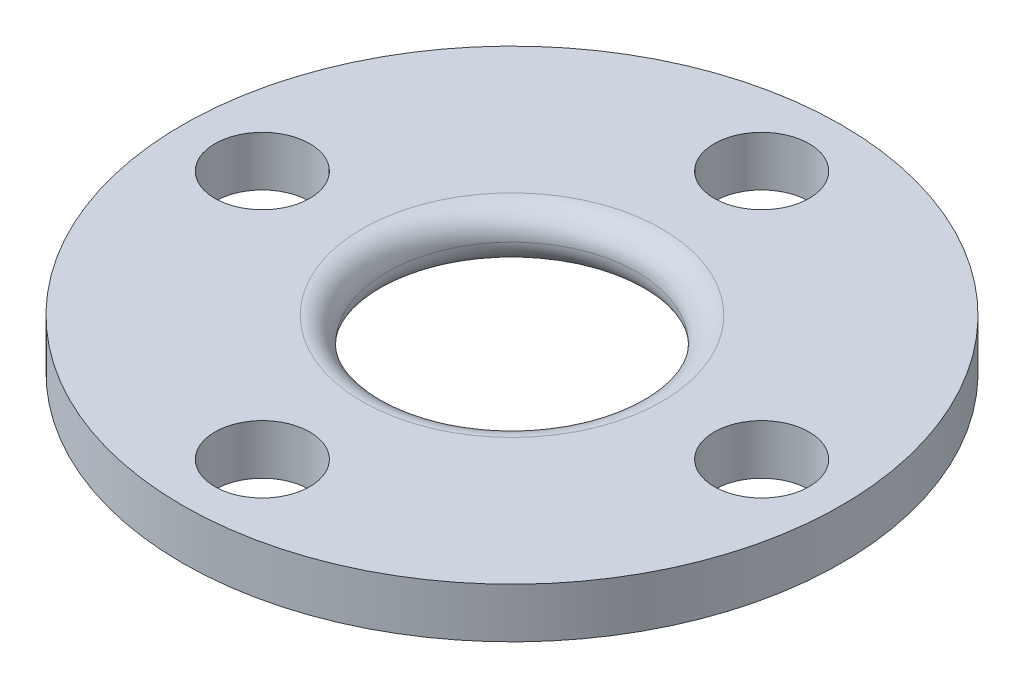
ISO-10303-21;
HEADER;
FILE_DESCRIPTION(('STEP AP214'),'2;1');
FILE_NAME('part.step','',(''),(''),'','','');
FILE_SCHEMA(('AUTOMOTIVE_DESIGN { 1 0 10303 214 1 1 1 1 }'));
ENDSEC;
DATA;
#1=APPLICATION_CONTEXT('core data for automotive mechanical design processes');
#2=APPLICATION_PROTOCOL_DEFINITION('international standard','automotive_design',2000,#1);
#3=PRODUCT_CONTEXT('',#1,'mechanical');
#4=PRODUCT('Part','Part','',(#3));
#5=PRODUCT_RELATED_PRODUCT_CATEGORY('part','',(#4));
#6=PRODUCT_DEFINITION_FORMATION('','',#4);
#7=PRODUCT_DEFINITION_CONTEXT('part definition',#1,'design');
#8=PRODUCT_DEFINITION('design','',#6,#7);
#9=PRODUCT_DEFINITION_SHAPE('','',#8);
#10=(LENGTH_UNIT() NAMED_UNIT(*) SI_UNIT(.MILLI.,.METRE.));
#11=(NAMED_UNIT(*) PLANE_ANGLE_UNIT() SI_UNIT($,.RADIAN.));
#12=(NAMED_UNIT(*) SI_UNIT($,.STERADIAN.) SOLID_ANGLE_UNIT());
#13=UNCERTAINTY_MEASURE_WITH_UNIT(LENGTH_MEASURE(1.E-05),#10,'distance_accuracy_value','');
#14=(GEOMETRIC_REPRESENTATION_CONTEXT(3) GLOBAL_UNCERTAINTY_ASSIGNED_CONTEXT((#13)) GLOBAL_UNIT_ASSIGNED_CONTEXT((#10,
#11,#12)) REPRESENTATION_CONTEXT('',''));
#15=CARTESIAN_POINT('',(0.,0.,0.));
#16=DIRECTION('',(0.,0.,1.));
#17=DIRECTION('',(1.,0.,0.));
#18=AXIS2_PLACEMENT_3D('',#15,#16,#17);
#19=CARTESIAN_POINT('',(0.,2.,0.));
#20=DIRECTION('',(0.,-1.,0.));
#21=DIRECTION('',(0.,0.,-1.));
#22=AXIS2_PLACEMENT_3D('',#19,#20,#21);
#23=CYLINDRICAL_SURFACE('',#22,13.2);
#24=CARTESIAN_POINT('',(0.,2.,0.));
#25=DIRECTION('',(0.,1.,0.));
#26=DIRECTION('',(0.,0.,1.));
#27=AXIS2_PLACEMENT_3D('',#24,#25,#26);
#28=CIRCLE('',#27,13.2);
#29=CARTESIAN_POINT('',(0.,2.,13.2));
#30=VERTEX_POINT('',#29);
#31=EDGE_CURVE('E53',#30,#30,#28,.T.);
#32=ORIENTED_EDGE('',*,*,#31,.F.);
#33=EDGE_LOOP('',(#32));
#34=FACE_BOUND('',#33,.T.);
#35=CARTESIAN_POINT('',(0.,0.,0.));
#36=DIRECTION('',(0.,1.,0.));
#37=DIRECTION('',(0.,0.,1.));
#38=AXIS2_PLACEMENT_3D('',#35,#36,#37);
#39=CIRCLE('',#38,13.2);
#40=CARTESIAN_POINT('',(0.,0.,13.2));
#41=VERTEX_POINT('',#40);
#42=EDGE_CURVE('E56',#41,#41,#39,.T.);
#43=ORIENTED_EDGE('',*,*,#42,.T.);
#44=EDGE_LOOP('',(#43));
#45=FACE_BOUND('',#44,.T.);
#46=ADVANCED_FACE('F41',(#34,#45),#23,.T.);
#47=CARTESIAN_POINT('',(0.,2.,0.));
#48=DIRECTION('',(0.,1.,0.));
#49=DIRECTION('',(0.,0.,1.));
#50=AXIS2_PLACEMENT_3D('',#47,#48,#49);
#51=PLANE('',#50);
#52=CARTESIAN_POINT('',(0.,2.,0.));
#53=DIRECTION('',(0.,1.,0.));
#54=DIRECTION('',(0.,0.,1.));
#55=AXIS2_PLACEMENT_3D('',#52,#53,#54);
#56=CIRCLE('',#55,6.);
#57=CARTESIAN_POINT('',(0.,2.,6.));
#58=VERTEX_POINT('',#57);
#59=EDGE_CURVE('E10',#58,#58,#56,.F.);
#60=ORIENTED_EDGE('',*,*,#59,.T.);
#61=EDGE_LOOP('',(#60));
#62=FACE_BOUND('',#61,.T.);
#63=CARTESIAN_POINT('',(10.,2.,0.));
#64=DIRECTION('',(0.,1.,0.));
#65=DIRECTION('',(-1.,0.,0.));
#66=AXIS2_PLACEMENT_3D('',#63,#64,#65);
#67=CIRCLE('',#66,1.9);
#68=CARTESIAN_POINT('',(8.1,2.,0.));
#69=VERTEX_POINT('',#68);
#70=EDGE_CURVE('E80',#69,#69,#67,.T.);
#71=ORIENTED_EDGE('',*,*,#70,.F.);
#72=EDGE_LOOP('',(#71));
#73=FACE_BOUND('',#72,.T.);
#74=CARTESIAN_POINT('',(0.,2.,10.));
#75=DIRECTION('',(0.,1.,0.));
#76=DIRECTION('',(0.,0.,-1.));
#77=AXIS2_PLACEMENT_3D('',#74,#75,#76);
#78=CIRCLE('',#77,1.9);
#79=CARTESIAN_POINT('',(0.,2.,8.1));
#80=VERTEX_POINT('',#79);
#81=EDGE_CURVE('E74',#80,#80,#78,.T.);
#82=ORIENTED_EDGE('',*,*,#81,.F.);
#83=EDGE_LOOP('',(#82));
#84=FACE_BOUND('',#83,.T.);
#85=CARTESIAN_POINT('',(-10.,2.,-1.04744440165294E-13));
#86=DIRECTION('',(0.,1.,0.));
#87=DIRECTION('',(1.,0.,0.));
#88=AXIS2_PLACEMENT_3D('',#85,#86,#87);
#89=CIRCLE('',#88,1.9);
#90=CARTESIAN_POINT('',(-8.1,2.,0.));
#91=VERTEX_POINT('',#90);
#92=EDGE_CURVE('E68',#91,#91,#89,.T.);
#93=ORIENTED_EDGE('',*,*,#92,.F.);
#94=EDGE_LOOP('',(#93));
#95=FACE_BOUND('',#94,.T.);
#96=CARTESIAN_POINT('',(0.,2.,-10.));
#97=DIRECTION('',(0.,1.,0.));
#98=DIRECTION('',(0.,0.,1.));
#99=AXIS2_PLACEMENT_3D('',#96,#97,#98);
#100=CIRCLE('',#99,1.9);
#101=CARTESIAN_POINT('',(0.,2.,-8.1));
#102=VERTEX_POINT('',#101);
#103=EDGE_CURVE('E62',#102,#102,#100,.T.);
#104=ORIENTED_EDGE('',*,*,#103,.F.);
#105=EDGE_LOOP('',(#104));
#106=FACE_BOUND('',#105,.T.);
#107=ORIENTED_EDGE('',*,*,#31,.T.);
#108=EDGE_LOOP('',(#107));
#109=FACE_BOUND('',#108,.T.);
#110=ADVANCED_FACE('F96',(#62,#73,#84,#95,#106,#109),#51,.T.);
#111=CARTESIAN_POINT('',(0.,0.,0.));
#112=DIRECTION('',(0.,1.,0.));
#113=DIRECTION('',(0.,0.,1.));
#114=AXIS2_PLACEMENT_3D('',#111,#112,#113);
#115=PLANE('',#114);
#116=CARTESIAN_POINT('',(0.,0.,0.));
#117=DIRECTION('',(0.,1.,0.));
#118=DIRECTION('',(0.,0.,1.));
#119=AXIS2_PLACEMENT_3D('',#116,#117,#118);
#120=CIRCLE('',#119,6.);
#121=CARTESIAN_POINT('',(0.,0.,6.));
#122=VERTEX_POINT('',#121);
#123=EDGE_CURVE('E49',#122,#122,#120,.T.);
#124=ORIENTED_EDGE('',*,*,#123,.T.);
#125=EDGE_LOOP('',(#124));
#126=FACE_BOUND('',#125,.T.);
#127=CARTESIAN_POINT('',(10.,0.,0.));
#128=DIRECTION('',(0.,1.,0.));
#129=DIRECTION('',(-1.,0.,0.));
#130=AXIS2_PLACEMENT_3D('',#127,#128,#129);
#131=CIRCLE('',#130,1.9);
#132=CARTESIAN_POINT('',(8.1,0.,0.));
#133=VERTEX_POINT('',#132);
#134=EDGE_CURVE('E65',#133,#133,#131,.T.);
#135=ORIENTED_EDGE('',*,*,#134,.T.);
#136=EDGE_LOOP('',(#135));
#137=FACE_BOUND('',#136,.T.);
#138=CARTESIAN_POINT('',(0.,0.,10.));
#139=DIRECTION('',(0.,1.,0.));
#140=DIRECTION('',(0.,0.,-1.));
#141=AXIS2_PLACEMENT_3D('',#138,#139,#140);
#142=CIRCLE('',#141,1.9);
#143=CARTESIAN_POINT('',(0.,0.,8.1));
#144=VERTEX_POINT('',#143);
#145=EDGE_CURVE('E77',#144,#144,#142,.T.);
#146=ORIENTED_EDGE('',*,*,#145,.T.);
#147=EDGE_LOOP('',(#146));
#148=FACE_BOUND('',#147,.T.);
#149=CARTESIAN_POINT('',(-10.,0.,-1.04744440165294E-13));
#150=DIRECTION('',(0.,1.,0.));
#151=DIRECTION('',(1.,0.,0.));
#152=AXIS2_PLACEMENT_3D('',#149,#150,#151);
#153=CIRCLE('',#152,1.9);
#154=CARTESIAN_POINT('',(-8.1,0.,0.));
#155=VERTEX_POINT('',#154);
#156=EDGE_CURVE('E71',#155,#155,#153,.T.);
#157=ORIENTED_EDGE('',*,*,#156,.T.);
#158=EDGE_LOOP('',(#157));
#159=FACE_BOUND('',#158,.T.);
#160=CARTESIAN_POINT('',(0.,0.,-10.));
#161=DIRECTION('',(0.,1.,0.));
#162=DIRECTION('',(0.,0.,1.));
#163=AXIS2_PLACEMENT_3D('',#160,#161,#162);
#164=CIRCLE('',#163,1.9);
#165=CARTESIAN_POINT('',(0.,0.,-8.1));
#166=VERTEX_POINT('',#165);
#167=EDGE_CURVE('E59',#166,#166,#164,.T.);
#168=ORIENTED_EDGE('',*,*,#167,.T.);
#169=EDGE_LOOP('',(#168));
#170=FACE_BOUND('',#169,.T.);
#171=ORIENTED_EDGE('',*,*,#42,.F.);
#172=EDGE_LOOP('',(#171));
#173=FACE_BOUND('',#172,.T.);
#174=ADVANCED_FACE('F86',(#126,#137,#148,#159,#170,#173),#115,.F.);
#175=CARTESIAN_POINT('',(0.,0.,-10.));
#176=DIRECTION('',(0.,1.,0.));
#177=DIRECTION('',(0.,0.,1.));
#178=AXIS2_PLACEMENT_3D('',#175,#176,#177);
#179=CYLINDRICAL_SURFACE('',#178,1.9);
#180=ORIENTED_EDGE('',*,*,#167,.F.);
#181=EDGE_LOOP('',(#180));
#182=FACE_BOUND('',#181,.T.);
#183=ORIENTED_EDGE('',*,*,#103,.T.);
#184=EDGE_LOOP('',(#183));
#185=FACE_BOUND('',#184,.T.);
#186=ADVANCED_FACE('F114',(#182,#185),#179,.F.);
#187=CARTESIAN_POINT('',(-10.,0.,-1.04744440165294E-13));
#188=DIRECTION('',(0.,1.,0.));
#189=DIRECTION('',(0.,0.,1.));
#190=AXIS2_PLACEMENT_3D('',#187,#188,#189);
#191=CYLINDRICAL_SURFACE('',#190,1.9);
#192=ORIENTED_EDGE('',*,*,#156,.F.);
#193=EDGE_LOOP('',(#192));
#194=FACE_BOUND('',#193,.T.);
#195=ORIENTED_EDGE('',*,*,#92,.T.);
#196=EDGE_LOOP('',(#195));
#197=FACE_BOUND('',#196,.T.);
#198=ADVANCED_FACE('F121',(#194,#197),#191,.F.);
#199=CARTESIAN_POINT('',(0.,0.,10.));
#200=DIRECTION('',(0.,1.,0.));
#201=DIRECTION('',(0.,0.,1.));
#202=AXIS2_PLACEMENT_3D('',#199,#200,#201);
#203=CYLINDRICAL_SURFACE('',#202,1.9);
#204=ORIENTED_EDGE('',*,*,#145,.F.);
#205=EDGE_LOOP('',(#204));
#206=FACE_BOUND('',#205,.T.);
#207=ORIENTED_EDGE('',*,*,#81,.T.);
#208=EDGE_LOOP('',(#207));
#209=FACE_BOUND('',#208,.T.);
#210=ADVANCED_FACE('F92',(#206,#209),#203,.F.);
#211=CARTESIAN_POINT('',(10.,0.,0.));
#212=DIRECTION('',(0.,1.,0.));
#213=DIRECTION('',(0.,0.,1.));
#214=AXIS2_PLACEMENT_3D('',#211,#212,#213);
#215=CYLINDRICAL_SURFACE('',#214,1.9);
#216=ORIENTED_EDGE('',*,*,#134,.F.);
#217=EDGE_LOOP('',(#216));
#218=FACE_BOUND('',#217,.T.);
#219=ORIENTED_EDGE('',*,*,#70,.T.);
#220=EDGE_LOOP('',(#219));
#221=FACE_BOUND('',#220,.T.);
#222=ADVANCED_FACE('F89',(#218,#221),#215,.F.);
#223=CARTESIAN_POINT('',(0.,1.,0.));
#224=DIRECTION('',(0.,1.,0.));
#225=DIRECTION('',(0.,0.,1.));
#226=AXIS2_PLACEMENT_3D('',#223,#224,#225);
#227=TOROIDAL_SURFACE('',#226,6.,1.);
#228=ORIENTED_EDGE('',*,*,#59,.F.);
#229=EDGE_LOOP('',(#228));
#230=FACE_BOUND('',#229,.T.);
#231=CARTESIAN_POINT('',(0.,1.,0.));
#232=DIRECTION('',(0.,1.,0.));
#233=DIRECTION('',(0.,0.,1.));
#234=AXIS2_PLACEMENT_3D('',#231,#232,#233);
#235=CIRCLE('',#234,5.);
#236=CARTESIAN_POINT('',(0.,1.,5.));
#237=VERTEX_POINT('',#236);
#238=EDGE_CURVE('E45',#237,#237,#235,.T.);
#239=ORIENTED_EDGE('',*,*,#238,.F.);
#240=EDGE_LOOP('',(#239));
#241=FACE_BOUND('',#240,.T.);
#242=ADVANCED_FACE('F43',(#230,#241),#227,.T.);
#243=CARTESIAN_POINT('',(0.,1.,0.));
#244=DIRECTION('',(0.,1.,0.));
#245=DIRECTION('',(0.,0.,1.));
#246=AXIS2_PLACEMENT_3D('',#243,#244,#245);
#247=TOROIDAL_SURFACE('',#246,6.,1.);
#248=ORIENTED_EDGE('',*,*,#238,.T.);
#249=EDGE_LOOP('',(#248));
#250=FACE_BOUND('',#249,.T.);
#251=ORIENTED_EDGE('',*,*,#123,.F.);
#252=EDGE_LOOP('',(#251));
#253=FACE_BOUND('',#252,.T.);
#254=ADVANCED_FACE('F124',(#250,#253),#247,.T.);
#255=CLOSED_SHELL('',(#46,#110,#174,#186,#198,#210,#222,#242,#254));
#256=MANIFOLD_SOLID_BREP('B2',#255);
#257=ADVANCED_BREP_SHAPE_REPRESENTATION('',(#18,#256),#14);
#258=SHAPE_DEFINITION_REPRESENTATION(#9,#257);
ENDSEC;
END-ISO-10303-21;
